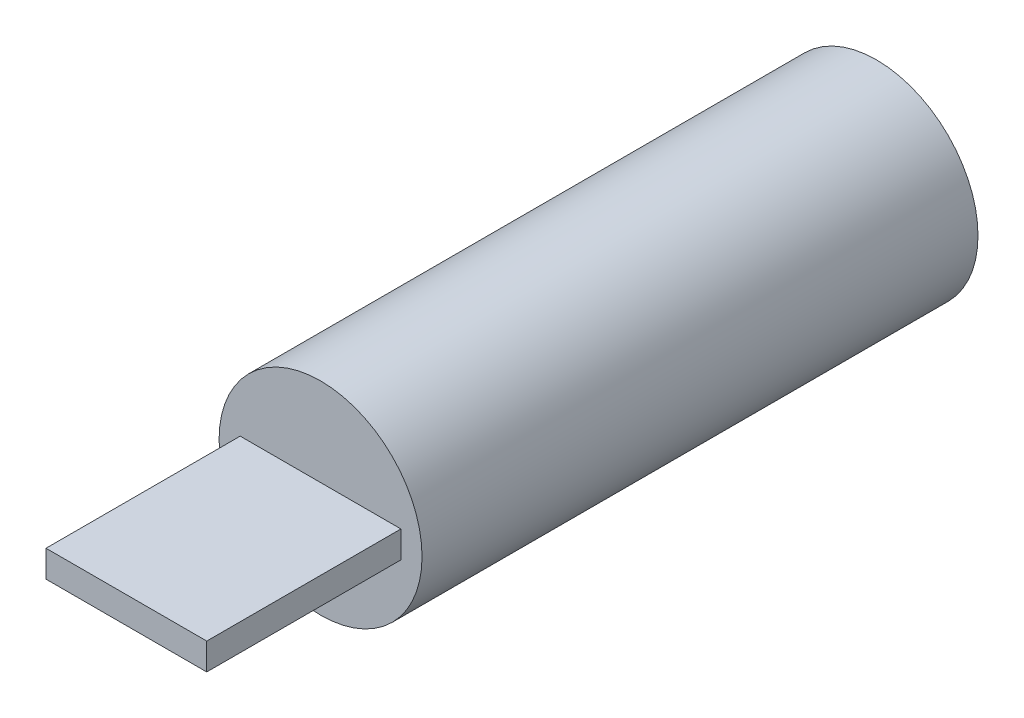
ISO-10303-21;
HEADER;
FILE_DESCRIPTION(('STEP AP214'),'2;1');
FILE_NAME('part.step','',(''),(''),'','','');
FILE_SCHEMA(('AUTOMOTIVE_DESIGN { 1 0 10303 214 1 1 1 1 }'));
ENDSEC;
DATA;
#1=APPLICATION_CONTEXT('core data for automotive mechanical design processes');
#2=APPLICATION_PROTOCOL_DEFINITION('international standard','automotive_design',2000,#1);
#3=PRODUCT_CONTEXT('',#1,'mechanical');
#4=PRODUCT('Part','Part','',(#3));
#5=PRODUCT_RELATED_PRODUCT_CATEGORY('part','',(#4));
#6=PRODUCT_DEFINITION_FORMATION('','',#4);
#7=PRODUCT_DEFINITION_CONTEXT('part definition',#1,'design');
#8=PRODUCT_DEFINITION('design','',#6,#7);
#9=PRODUCT_DEFINITION_SHAPE('','',#8);
#10=(LENGTH_UNIT() NAMED_UNIT(*) SI_UNIT(.MILLI.,.METRE.));
#11=(NAMED_UNIT(*) PLANE_ANGLE_UNIT() SI_UNIT($,.RADIAN.));
#12=(NAMED_UNIT(*) SI_UNIT($,.STERADIAN.) SOLID_ANGLE_UNIT());
#13=UNCERTAINTY_MEASURE_WITH_UNIT(LENGTH_MEASURE(1.E-05),#10,'distance_accuracy_value','');
#14=(GEOMETRIC_REPRESENTATION_CONTEXT(3) GLOBAL_UNCERTAINTY_ASSIGNED_CONTEXT((#13)) GLOBAL_UNIT_ASSIGNED_CONTEXT((#10,
#11,#12)) REPRESENTATION_CONTEXT('',''));
#15=CARTESIAN_POINT('',(0.,0.,0.));
#16=DIRECTION('',(0.,0.,1.));
#17=DIRECTION('',(1.,0.,0.));
#18=AXIS2_PLACEMENT_3D('',#15,#16,#17);
#19=CARTESIAN_POINT('',(0.,0.,65.8876));
#20=DIRECTION('',(0.,0.,-1.));
#21=DIRECTION('',(-1.,0.,0.));
#22=AXIS2_PLACEMENT_3D('',#19,#20,#21);
#23=CYLINDRICAL_SURFACE('',#22,12.0269);
#24=CARTESIAN_POINT('',(0.,0.,65.8876));
#25=DIRECTION('',(0.,0.,1.));
#26=DIRECTION('',(1.,0.,0.));
#27=AXIS2_PLACEMENT_3D('',#24,#25,#26);
#28=CIRCLE('',#27,12.0269);
#29=CARTESIAN_POINT('',(12.0269,0.,65.8876));
#30=VERTEX_POINT('',#29);
#31=EDGE_CURVE('E11',#30,#30,#28,.T.);
#32=ORIENTED_EDGE('',*,*,#31,.F.);
#33=EDGE_LOOP('',(#32));
#34=FACE_BOUND('',#33,.T.);
#35=CARTESIAN_POINT('',(0.,0.,0.));
#36=DIRECTION('',(0.,0.,1.));
#37=DIRECTION('',(1.,0.,0.));
#38=AXIS2_PLACEMENT_3D('',#35,#36,#37);
#39=CIRCLE('',#38,12.0269);
#40=CARTESIAN_POINT('',(12.0269,0.,0.));
#41=VERTEX_POINT('',#40);
#42=EDGE_CURVE('E38',#41,#41,#39,.T.);
#43=ORIENTED_EDGE('',*,*,#42,.T.);
#44=EDGE_LOOP('',(#43));
#45=FACE_BOUND('',#44,.T.);
#46=ADVANCED_FACE('F35',(#34,#45),#23,.T.);
#47=CARTESIAN_POINT('',(0.,0.,65.8876));
#48=DIRECTION('',(0.,0.,1.));
#49=DIRECTION('',(1.,0.,0.));
#50=AXIS2_PLACEMENT_3D('',#47,#48,#49);
#51=PLANE('',#50);
#52=DIRECTION('',(0.,1.,0.));
#53=VECTOR('',#52,1.);
#54=CARTESIAN_POINT('',(9.525,-1.5875,65.8876));
#55=LINE('',#54,#53);
#56=CARTESIAN_POINT('',(9.525,-1.5875,65.8876));
#57=VERTEX_POINT('',#56);
#58=CARTESIAN_POINT('',(9.525,1.5875,65.8876));
#59=VERTEX_POINT('',#58);
#60=EDGE_CURVE('E49',#57,#59,#55,.T.);
#61=ORIENTED_EDGE('',*,*,#60,.F.);
#62=DIRECTION('',(1.,0.,0.));
#63=VECTOR('',#62,1.);
#64=CARTESIAN_POINT('',(-9.525,-1.5875,65.8876));
#65=LINE('',#64,#63);
#66=CARTESIAN_POINT('',(-9.525,-1.5875,65.8876));
#67=VERTEX_POINT('',#66);
#68=EDGE_CURVE('E53',#67,#57,#65,.T.);
#69=ORIENTED_EDGE('',*,*,#68,.F.);
#70=DIRECTION('',(0.,-1.,0.));
#71=VECTOR('',#70,1.);
#72=CARTESIAN_POINT('',(-9.525,-1.5875,65.8876));
#73=LINE('',#72,#71);
#74=CARTESIAN_POINT('',(-9.525,1.5875,65.8876));
#75=VERTEX_POINT('',#74);
#76=EDGE_CURVE('E105',#75,#67,#73,.T.);
#77=ORIENTED_EDGE('',*,*,#76,.F.);
#78=DIRECTION('',(-1.,0.,0.));
#79=VECTOR('',#78,1.);
#80=CARTESIAN_POINT('',(-9.525,1.5875,65.8876));
#81=LINE('',#80,#79);
#82=EDGE_CURVE('E107',#59,#75,#81,.T.);
#83=ORIENTED_EDGE('',*,*,#82,.F.);
#84=EDGE_LOOP('',(#61,#69,#77,#83));
#85=FACE_BOUND('',#84,.T.);
#86=ORIENTED_EDGE('',*,*,#31,.T.);
#87=EDGE_LOOP('',(#86));
#88=FACE_BOUND('',#87,.T.);
#89=ADVANCED_FACE('F125',(#85,#88),#51,.T.);
#90=CARTESIAN_POINT('',(0.,0.,0.));
#91=DIRECTION('',(0.,0.,1.));
#92=DIRECTION('',(1.,0.,0.));
#93=AXIS2_PLACEMENT_3D('',#90,#91,#92);
#94=PLANE('',#93);
#95=ORIENTED_EDGE('',*,*,#42,.F.);
#96=EDGE_LOOP('',(#95));
#97=FACE_BOUND('',#96,.T.);
#98=ADVANCED_FACE('F131',(#97),#94,.F.);
#99=CARTESIAN_POINT('',(9.525,-1.5875,88.9));
#100=DIRECTION('',(-1.,0.,0.));
#101=DIRECTION('',(0.,0.,1.));
#102=AXIS2_PLACEMENT_3D('',#99,#100,#101);
#103=PLANE('',#102);
#104=ORIENTED_EDGE('',*,*,#60,.T.);
#105=DIRECTION('',(0.,0.,-1.));
#106=VECTOR('',#105,1.);
#107=CARTESIAN_POINT('',(9.525,1.5875,88.9));
#108=LINE('',#107,#106);
#109=CARTESIAN_POINT('',(9.525,1.5875,88.9));
#110=VERTEX_POINT('',#109);
#111=EDGE_CURVE('E78',#110,#59,#108,.T.);
#112=ORIENTED_EDGE('',*,*,#111,.F.);
#113=DIRECTION('',(0.,1.,0.));
#114=VECTOR('',#113,1.);
#115=CARTESIAN_POINT('',(9.525,-1.5875,88.9));
#116=LINE('',#115,#114);
#117=CARTESIAN_POINT('',(9.525,-1.5875,88.9));
#118=VERTEX_POINT('',#117);
#119=EDGE_CURVE('E84',#118,#110,#116,.T.);
#120=ORIENTED_EDGE('',*,*,#119,.F.);
#121=DIRECTION('',(0.,0.,-1.));
#122=VECTOR('',#121,1.);
#123=CARTESIAN_POINT('',(9.525,-1.5875,88.9));
#124=LINE('',#123,#122);
#125=EDGE_CURVE('E102',#118,#57,#124,.T.);
#126=ORIENTED_EDGE('',*,*,#125,.T.);
#127=EDGE_LOOP('',(#104,#112,#120,#126));
#128=FACE_BOUND('',#127,.T.);
#129=ADVANCED_FACE('F94',(#128),#103,.F.);
#130=CARTESIAN_POINT('',(-9.525,1.5875,88.9));
#131=DIRECTION('',(0.,-1.,0.));
#132=DIRECTION('',(0.,0.,-1.));
#133=AXIS2_PLACEMENT_3D('',#130,#131,#132);
#134=PLANE('',#133);
#135=ORIENTED_EDGE('',*,*,#82,.T.);
#136=DIRECTION('',(0.,0.,-1.));
#137=VECTOR('',#136,1.);
#138=CARTESIAN_POINT('',(-9.525,1.5875,88.9));
#139=LINE('',#138,#137);
#140=CARTESIAN_POINT('',(-9.525,1.5875,88.9));
#141=VERTEX_POINT('',#140);
#142=EDGE_CURVE('E80',#141,#75,#139,.T.);
#143=ORIENTED_EDGE('',*,*,#142,.F.);
#144=DIRECTION('',(-1.,0.,0.));
#145=VECTOR('',#144,1.);
#146=CARTESIAN_POINT('',(-9.525,1.5875,88.9));
#147=LINE('',#146,#145);
#148=EDGE_CURVE('E73',#110,#141,#147,.T.);
#149=ORIENTED_EDGE('',*,*,#148,.F.);
#150=ORIENTED_EDGE('',*,*,#111,.T.);
#151=EDGE_LOOP('',(#135,#143,#149,#150));
#152=FACE_BOUND('',#151,.T.);
#153=ADVANCED_FACE('F76',(#152),#134,.F.);
#154=CARTESIAN_POINT('',(-9.525,-1.5875,88.9));
#155=DIRECTION('',(1.,0.,0.));
#156=DIRECTION('',(0.,0.,-1.));
#157=AXIS2_PLACEMENT_3D('',#154,#155,#156);
#158=PLANE('',#157);
#159=ORIENTED_EDGE('',*,*,#76,.T.);
#160=DIRECTION('',(0.,0.,-1.));
#161=VECTOR('',#160,1.);
#162=CARTESIAN_POINT('',(-9.525,-1.5875,88.9));
#163=LINE('',#162,#161);
#164=CARTESIAN_POINT('',(-9.525,-1.5875,88.9));
#165=VERTEX_POINT('',#164);
#166=EDGE_CURVE('E97',#165,#67,#163,.T.);
#167=ORIENTED_EDGE('',*,*,#166,.F.);
#168=DIRECTION('',(0.,-1.,0.));
#169=VECTOR('',#168,1.);
#170=CARTESIAN_POINT('',(-9.525,-1.5875,88.9));
#171=LINE('',#170,#169);
#172=EDGE_CURVE('E83',#141,#165,#171,.T.);
#173=ORIENTED_EDGE('',*,*,#172,.F.);
#174=ORIENTED_EDGE('',*,*,#142,.T.);
#175=EDGE_LOOP('',(#159,#167,#173,#174));
#176=FACE_BOUND('',#175,.T.);
#177=ADVANCED_FACE('F113',(#176),#158,.F.);
#178=CARTESIAN_POINT('',(-9.525,-1.5875,88.9));
#179=DIRECTION('',(0.,1.,0.));
#180=DIRECTION('',(0.,0.,1.));
#181=AXIS2_PLACEMENT_3D('',#178,#179,#180);
#182=PLANE('',#181);
#183=ORIENTED_EDGE('',*,*,#68,.T.);
#184=ORIENTED_EDGE('',*,*,#125,.F.);
#185=DIRECTION('',(1.,0.,0.));
#186=VECTOR('',#185,1.);
#187=CARTESIAN_POINT('',(-9.525,-1.5875,88.9));
#188=LINE('',#187,#186);
#189=EDGE_CURVE('E89',#165,#118,#188,.T.);
#190=ORIENTED_EDGE('',*,*,#189,.F.);
#191=ORIENTED_EDGE('',*,*,#166,.T.);
#192=EDGE_LOOP('',(#183,#184,#190,#191));
#193=FACE_BOUND('',#192,.T.);
#194=ADVANCED_FACE('F115',(#193),#182,.F.);
#195=CARTESIAN_POINT('',(0.,0.,88.9));
#196=DIRECTION('',(0.,0.,-1.));
#197=DIRECTION('',(-1.,0.,0.));
#198=AXIS2_PLACEMENT_3D('',#195,#196,#197);
#199=PLANE('',#198);
#200=ORIENTED_EDGE('',*,*,#119,.T.);
#201=ORIENTED_EDGE('',*,*,#148,.T.);
#202=ORIENTED_EDGE('',*,*,#172,.T.);
#203=ORIENTED_EDGE('',*,*,#189,.T.);
#204=EDGE_LOOP('',(#200,#201,#202,#203));
#205=FACE_BOUND('',#204,.T.);
#206=ADVANCED_FACE('F87',(#205),#199,.F.);
#207=CLOSED_SHELL('',(#46,#89,#98,#129,#153,#177,#194,#206));
#208=MANIFOLD_SOLID_BREP('B2',#207);
#209=ADVANCED_BREP_SHAPE_REPRESENTATION('',(#18,#208),#14);
#210=SHAPE_DEFINITION_REPRESENTATION(#9,#209);
ENDSEC;
END-ISO-10303-21;
